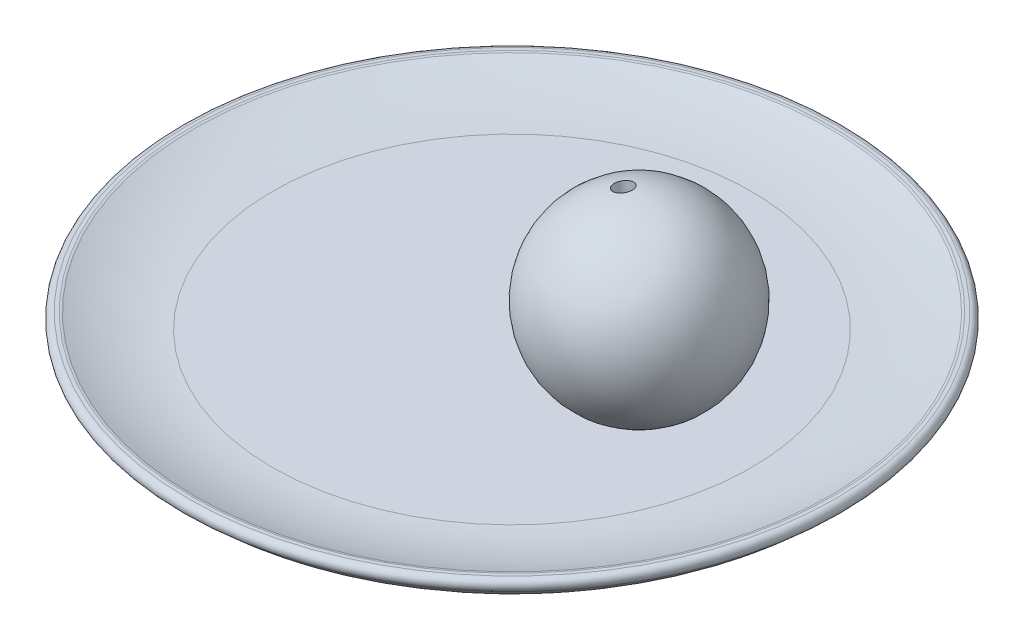
ISO-10303-21;
HEADER;
FILE_DESCRIPTION(('STEP AP214'),'2;1');
FILE_NAME('part.step','',(''),(''),'','','');
FILE_SCHEMA(('AUTOMOTIVE_DESIGN { 1 0 10303 214 1 1 1 1 }'));
ENDSEC;
DATA;
#1=APPLICATION_CONTEXT('core data for automotive mechanical design processes');
#2=APPLICATION_PROTOCOL_DEFINITION('international standard','automotive_design',2000,#1);
#3=PRODUCT_CONTEXT('',#1,'mechanical');
#4=PRODUCT('Part','Part','',(#3));
#5=PRODUCT_RELATED_PRODUCT_CATEGORY('part','',(#4));
#6=PRODUCT_DEFINITION_FORMATION('','',#4);
#7=PRODUCT_DEFINITION_CONTEXT('part definition',#1,'design');
#8=PRODUCT_DEFINITION('design','',#6,#7);
#9=PRODUCT_DEFINITION_SHAPE('','',#8);
#10=(LENGTH_UNIT() NAMED_UNIT(*) SI_UNIT(.MILLI.,.METRE.));
#11=(NAMED_UNIT(*) PLANE_ANGLE_UNIT() SI_UNIT($,.RADIAN.));
#12=(NAMED_UNIT(*) SI_UNIT($,.STERADIAN.) SOLID_ANGLE_UNIT());
#13=UNCERTAINTY_MEASURE_WITH_UNIT(LENGTH_MEASURE(1.E-05),#10,'distance_accuracy_value','');
#14=(GEOMETRIC_REPRESENTATION_CONTEXT(3) GLOBAL_UNCERTAINTY_ASSIGNED_CONTEXT((#13)) GLOBAL_UNIT_ASSIGNED_CONTEXT((#10,
#11,#12)) REPRESENTATION_CONTEXT('',''));
#15=CARTESIAN_POINT('',(0.,0.,0.));
#16=DIRECTION('',(0.,0.,1.));
#17=DIRECTION('',(1.,0.,0.));
#18=AXIS2_PLACEMENT_3D('',#15,#16,#17);
#19=CARTESIAN_POINT('',(0.,7.5,0.));
#20=DIRECTION('',(0.,1.,0.));
#21=DIRECTION('',(0.,0.,1.));
#22=AXIS2_PLACEMENT_3D('',#19,#20,#21);
#23=PLANE('',#22);
#24=CARTESIAN_POINT('',(0.,7.5,0.));
#25=DIRECTION('',(0.,1.,0.));
#26=DIRECTION('',(0.,0.,1.));
#27=AXIS2_PLACEMENT_3D('',#24,#25,#26);
#28=CIRCLE('',#27,52.7572469611249);
#29=CARTESIAN_POINT('',(0.,7.5,52.7572469611249));
#30=VERTEX_POINT('',#29);
#31=EDGE_CURVE('E57',#30,#30,#28,.T.);
#32=ORIENTED_EDGE('',*,*,#31,.T.);
#33=EDGE_LOOP('',(#32));
#34=FACE_BOUND('',#33,.T.);
#35=CARTESIAN_POINT('',(0.,7.5,0.));
#36=DIRECTION('',(0.,1.,0.));
#37=DIRECTION('',(0.,0.,1.));
#38=AXIS2_PLACEMENT_3D('',#35,#36,#37);
#39=CIRCLE('',#38,52.1910452696975);
#40=CARTESIAN_POINT('',(0.,7.5,52.1910452696975));
#41=VERTEX_POINT('',#40);
#42=EDGE_CURVE('E61',#41,#41,#39,.F.);
#43=ORIENTED_EDGE('',*,*,#42,.T.);
#44=EDGE_LOOP('',(#43));
#45=FACE_BOUND('',#44,.T.);
#46=ADVANCED_FACE('F37',(#34,#45),#23,.T.);
#47=CARTESIAN_POINT('',(0.,0.,0.));
#48=DIRECTION('',(0.,1.,0.));
#49=DIRECTION('',(0.,0.,1.));
#50=AXIS2_PLACEMENT_3D('',#47,#48,#49);
#51=PLANE('',#50);
#52=CARTESIAN_POINT('',(0.,0.,0.));
#53=DIRECTION('',(0.,1.,0.));
#54=DIRECTION('',(0.,0.,1.));
#55=AXIS2_PLACEMENT_3D('',#52,#53,#54);
#56=CIRCLE('',#55,39.387505004004);
#57=CARTESIAN_POINT('',(0.,0.,39.387505004004));
#58=VERTEX_POINT('',#57);
#59=EDGE_CURVE('E65',#58,#58,#56,.F.);
#60=ORIENTED_EDGE('',*,*,#59,.T.);
#61=EDGE_LOOP('',(#60));
#62=FACE_BOUND('',#61,.T.);
#63=ADVANCED_FACE('F98',(#62),#51,.F.);
#64=CARTESIAN_POINT('',(0.,5.,0.));
#65=DIRECTION('',(0.,1.,0.));
#66=DIRECTION('',(0.,0.,1.));
#67=AXIS2_PLACEMENT_3D('',#64,#65,#66);
#68=PLANE('',#67);
#69=CARTESIAN_POINT('',(20.7266897814975,5.,0.));
#70=DIRECTION('',(0.,1.,0.));
#71=DIRECTION('',(0.,0.,1.));
#72=AXIS2_PLACEMENT_3D('',#69,#70,#71);
#73=CIRCLE('',#72,3.79975114295506);
#74=CARTESIAN_POINT('',(20.7266897814975,5.,3.79975114295506));
#75=VERTEX_POINT('',#74);
#76=EDGE_CURVE('E10',#75,#75,#73,.T.);
#77=ORIENTED_EDGE('',*,*,#76,.F.);
#78=EDGE_LOOP('',(#77));
#79=FACE_BOUND('',#78,.T.);
#80=CARTESIAN_POINT('',(0.,5.,0.));
#81=DIRECTION('',(0.,1.,0.));
#82=DIRECTION('',(0.,0.,1.));
#83=AXIS2_PLACEMENT_3D('',#80,#81,#82);
#84=CIRCLE('',#83,39.0096189432334);
#85=CARTESIAN_POINT('',(0.,5.,39.0096189432334));
#86=VERTEX_POINT('',#85);
#87=EDGE_CURVE('E69',#86,#86,#84,.T.);
#88=ORIENTED_EDGE('',*,*,#87,.T.);
#89=EDGE_LOOP('',(#88));
#90=FACE_BOUND('',#89,.T.);
#91=ADVANCED_FACE('F104',(#79,#90),#68,.T.);
#92=CARTESIAN_POINT('',(0.,40.,0.));
#93=DIRECTION('',(0.,-1.,0.));
#94=DIRECTION('',(0.,0.,-1.));
#95=AXIS2_PLACEMENT_3D('',#92,#93,#94);
#96=TOROIDAL_SURFACE('',#95,39.0096189432334,35.);
#97=CARTESIAN_POINT('',(0.,7.43055555555559,0.));
#98=DIRECTION('',(0.,1.,0.));
#99=DIRECTION('',(0.,0.,1.));
#100=AXIS2_PLACEMENT_3D('',#97,#98,#99);
#101=CIRCLE('',#100,51.8248945384068);
#102=CARTESIAN_POINT('',(0.,7.43055555555559,51.8248945384068));
#103=VERTEX_POINT('',#102);
#104=EDGE_CURVE('E46',#103,#103,#101,.T.);
#105=ORIENTED_EDGE('',*,*,#104,.T.);
#106=EDGE_LOOP('',(#105));
#107=FACE_BOUND('',#106,.T.);
#108=ORIENTED_EDGE('',*,*,#87,.F.);
#109=EDGE_LOOP('',(#108));
#110=FACE_BOUND('',#109,.T.);
#111=ADVANCED_FACE('F109',(#107,#110),#96,.F.);
#112=CARTESIAN_POINT('',(0.,20.,0.));
#113=DIRECTION('',(0.,-1.,0.));
#114=DIRECTION('',(0.,0.,-1.));
#115=AXIS2_PLACEMENT_3D('',#112,#113,#114);
#116=TOROIDAL_SURFACE('',#115,39.387505004004,20.);
#117=CARTESIAN_POINT('',(0.,5.78947368421052,0.));
#118=DIRECTION('',(0.,1.,0.));
#119=DIRECTION('',(0.,0.,1.));
#120=AXIS2_PLACEMENT_3D('',#117,#118,#119);
#121=CIRCLE('',#120,53.4609175904471);
#122=CARTESIAN_POINT('',(0.,5.78947368421052,53.4609175904471));
#123=VERTEX_POINT('',#122);
#124=EDGE_CURVE('E51',#123,#123,#121,.F.);
#125=ORIENTED_EDGE('',*,*,#124,.T.);
#126=EDGE_LOOP('',(#125));
#127=FACE_BOUND('',#126,.T.);
#128=ORIENTED_EDGE('',*,*,#59,.F.);
#129=EDGE_LOOP('',(#128));
#130=FACE_BOUND('',#129,.T.);
#131=ADVANCED_FACE('F112',(#127,#130),#116,.T.);
#132=CARTESIAN_POINT('',(0.,6.5,0.));
#133=DIRECTION('',(0.,1.,0.));
#134=DIRECTION('',(0.,0.,1.));
#135=AXIS2_PLACEMENT_3D('',#132,#133,#134);
#136=TOROIDAL_SURFACE('',#135,52.7572469611249,1.);
#137=ORIENTED_EDGE('',*,*,#124,.F.);
#138=EDGE_LOOP('',(#137));
#139=FACE_BOUND('',#138,.T.);
#140=ORIENTED_EDGE('',*,*,#31,.F.);
#141=EDGE_LOOP('',(#140));
#142=FACE_BOUND('',#141,.T.);
#143=ADVANCED_FACE('F94',(#139,#142),#136,.T.);
#144=CARTESIAN_POINT('',(0.,6.5,0.));
#145=DIRECTION('',(0.,1.,0.));
#146=DIRECTION('',(0.,0.,1.));
#147=AXIS2_PLACEMENT_3D('',#144,#145,#146);
#148=TOROIDAL_SURFACE('',#147,52.1910452696975,1.);
#149=ORIENTED_EDGE('',*,*,#42,.F.);
#150=EDGE_LOOP('',(#149));
#151=FACE_BOUND('',#150,.T.);
#152=ORIENTED_EDGE('',*,*,#104,.F.);
#153=EDGE_LOOP('',(#152));
#154=FACE_BOUND('',#153,.T.);
#155=ADVANCED_FACE('F39',(#151,#154),#148,.T.);
#156=CARTESIAN_POINT('',(20.7266897814975,19.5107508851752,0.));
#157=DIRECTION('',(0.,-1.,0.));
#158=DIRECTION('',(-1.,0.,0.));
#159=AXIS2_PLACEMENT_3D('',#156,#157,#158);
#160=SPHERICAL_SURFACE('',#159,15.);
#161=CARTESIAN_POINT('',(18.1350234526716,34.2088210183603,0.));
#162=DIRECTION('',(0.173648177666935,-0.984807753012207,0.));
#163=DIRECTION('',(0.984807753012207,0.173648177666935,0.));
#164=AXIS2_PLACEMENT_3D('',#161,#162,#163);
#165=CIRCLE('',#164,1.5);
#166=CARTESIAN_POINT('',(19.6122350821899,34.4692932848607,0.));
#167=VERTEX_POINT('',#166);
#168=EDGE_CURVE('E41',#167,#167,#165,.F.);
#169=ORIENTED_EDGE('',*,*,#168,.F.);
#170=EDGE_LOOP('',(#169));
#171=FACE_BOUND('',#170,.T.);
#172=ORIENTED_EDGE('',*,*,#76,.T.);
#173=EDGE_LOOP('',(#172));
#174=FACE_BOUND('',#173,.T.);
#175=ADVANCED_FACE('F85',(#171,#174),#160,.T.);
#176=CARTESIAN_POINT('',(20.7266897814975,19.5107508851752,0.));
#177=DIRECTION('',(-0.173648177666935,0.984807753012207,0.));
#178=DIRECTION('',(-0.984807753012207,-0.173648177666935,0.));
#179=AXIS2_PLACEMENT_3D('',#176,#177,#178);
#180=CYLINDRICAL_SURFACE('',#179,1.5);
#181=ORIENTED_EDGE('',*,*,#168,.T.);
#182=EDGE_LOOP('',(#181));
#183=FACE_BOUND('',#182,.T.);
#184=CARTESIAN_POINT('',(20.7266897814975,19.5107508851752,0.));
#185=DIRECTION('',(-0.173648177666935,0.984807753012207,0.));
#186=DIRECTION('',(-0.984807753012207,-0.173648177666935,0.));
#187=AXIS2_PLACEMENT_3D('',#184,#185,#186);
#188=CIRCLE('',#187,1.5);
#189=CARTESIAN_POINT('',(19.2494781519792,19.2502786186747,0.));
#190=VERTEX_POINT('',#189);
#191=EDGE_CURVE('E73',#190,#190,#188,.T.);
#192=ORIENTED_EDGE('',*,*,#191,.F.);
#193=EDGE_LOOP('',(#192));
#194=FACE_BOUND('',#193,.T.);
#195=ADVANCED_FACE('F82',(#183,#194),#180,.F.);
#196=CARTESIAN_POINT('',(20.7266897814975,19.5107508851752,0.));
#197=DIRECTION('',(-0.173648177666935,0.984807753012207,0.));
#198=DIRECTION('',(-0.984807753012207,-0.173648177666935,0.));
#199=AXIS2_PLACEMENT_3D('',#196,#197,#198);
#200=PLANE('',#199);
#201=ORIENTED_EDGE('',*,*,#191,.T.);
#202=EDGE_LOOP('',(#201));
#203=FACE_BOUND('',#202,.T.);
#204=ADVANCED_FACE('F92',(#203),#200,.T.);
#205=CLOSED_SHELL('',(#46,#63,#91,#111,#131,#143,#155,#175,#195,#204));
#206=MANIFOLD_SOLID_BREP('B2',#205);
#207=ADVANCED_BREP_SHAPE_REPRESENTATION('',(#18,#206),#14);
#208=SHAPE_DEFINITION_REPRESENTATION(#9,#207);
ENDSEC;
END-ISO-10303-21;
